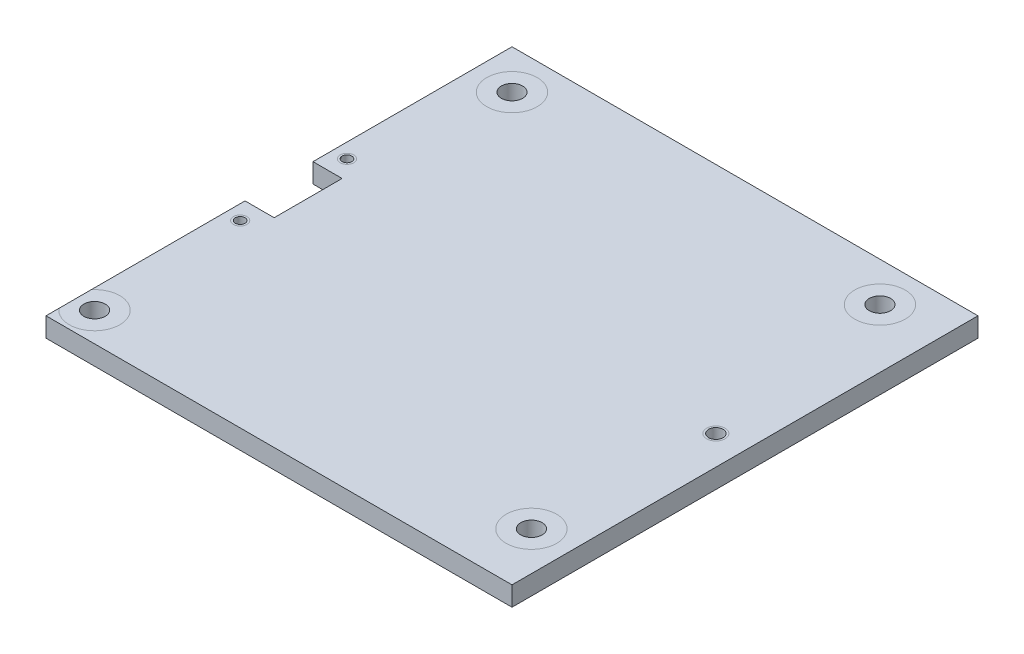
ISO-10303-21;
HEADER;
FILE_DESCRIPTION(('STEP AP214'),'2;1');
FILE_NAME('part.step','',(''),(''),'','','');
FILE_SCHEMA(('AUTOMOTIVE_DESIGN { 1 0 10303 214 1 1 1 1 }'));
ENDSEC;
DATA;
#1=APPLICATION_CONTEXT('core data for automotive mechanical design processes');
#2=APPLICATION_PROTOCOL_DEFINITION('international standard','automotive_design',2000,#1);
#3=PRODUCT_CONTEXT('',#1,'mechanical');
#4=PRODUCT('Part','Part','',(#3));
#5=PRODUCT_RELATED_PRODUCT_CATEGORY('part','',(#4));
#6=PRODUCT_DEFINITION_FORMATION('','',#4);
#7=PRODUCT_DEFINITION_CONTEXT('part definition',#1,'design');
#8=PRODUCT_DEFINITION('design','',#6,#7);
#9=PRODUCT_DEFINITION_SHAPE('','',#8);
#10=(LENGTH_UNIT() NAMED_UNIT(*) SI_UNIT(.MILLI.,.METRE.));
#11=(NAMED_UNIT(*) PLANE_ANGLE_UNIT() SI_UNIT($,.RADIAN.));
#12=(NAMED_UNIT(*) SI_UNIT($,.STERADIAN.) SOLID_ANGLE_UNIT());
#13=UNCERTAINTY_MEASURE_WITH_UNIT(LENGTH_MEASURE(1.E-05),#10,'distance_accuracy_value','');
#14=(GEOMETRIC_REPRESENTATION_CONTEXT(3) GLOBAL_UNCERTAINTY_ASSIGNED_CONTEXT((#13)) GLOBAL_UNIT_ASSIGNED_CONTEXT((#10,
#11,#12)) REPRESENTATION_CONTEXT('',''));
#15=CARTESIAN_POINT('',(0.,0.,0.));
#16=DIRECTION('',(0.,0.,1.));
#17=DIRECTION('',(1.,0.,0.));
#18=AXIS2_PLACEMENT_3D('',#15,#16,#17);
#19=CARTESIAN_POINT('',(15.103448275862,-2.,-34.5));
#20=DIRECTION('',(0.,1.,0.));
#21=DIRECTION('',(0.,0.,1.));
#22=AXIS2_PLACEMENT_3D('',#19,#20,#21);
#23=PLANE('',#22);
#24=CARTESIAN_POINT('',(1.5,-2.,-18.5));
#25=DIRECTION('',(0.,1.,0.));
#26=DIRECTION('',(0.,0.,1.));
#27=AXIS2_PLACEMENT_3D('',#24,#25,#26);
#28=CIRCLE('',#27,0.700000000000001);
#29=CARTESIAN_POINT('',(1.5,-2.,-17.8));
#30=VERTEX_POINT('',#29);
#31=EDGE_CURVE('E213',#30,#30,#28,.F.);
#32=ORIENTED_EDGE('',*,*,#31,.F.);
#33=EDGE_LOOP('',(#32));
#34=FACE_BOUND('',#33,.T.);
#35=CARTESIAN_POINT('',(4.05,-2.,-43.95));
#36=DIRECTION('',(0.,1.,0.));
#37=DIRECTION('',(0.,0.,1.));
#38=AXIS2_PLACEMENT_3D('',#35,#36,#37);
#39=CIRCLE('',#38,2.59999999999999);
#40=CARTESIAN_POINT('',(4.05,-2.,-41.35));
#41=VERTEX_POINT('',#40);
#42=EDGE_CURVE('E197',#41,#41,#39,.F.);
#43=ORIENTED_EDGE('',*,*,#42,.F.);
#44=EDGE_LOOP('',(#43));
#45=FACE_BOUND('',#44,.T.);
#46=CARTESIAN_POINT('',(44.,-2.,-6.));
#47=DIRECTION('',(0.,1.,0.));
#48=DIRECTION('',(0.,0.,1.));
#49=AXIS2_PLACEMENT_3D('',#46,#47,#48);
#50=CIRCLE('',#49,2.6);
#51=CARTESIAN_POINT('',(44.,-2.,-3.4));
#52=VERTEX_POINT('',#51);
#53=EDGE_CURVE('E181',#52,#52,#50,.F.);
#54=ORIENTED_EDGE('',*,*,#53,.F.);
#55=EDGE_LOOP('',(#54));
#56=FACE_BOUND('',#55,.T.);
#57=DIRECTION('',(0.,0.,1.));
#58=VECTOR('',#57,1.);
#59=CARTESIAN_POINT('',(2.99999999999999,-2.,-27.5));
#60=LINE('',#59,#58);
#61=CARTESIAN_POINT('',(2.99999999999999,-2.,-27.5));
#62=VERTEX_POINT('',#61);
#63=CARTESIAN_POINT('',(2.99999999999999,-2.,-20.5));
#64=VERTEX_POINT('',#63);
#65=EDGE_CURVE('E240',#62,#64,#60,.T.);
#66=ORIENTED_EDGE('',*,*,#65,.F.);
#67=DIRECTION('',(1.,0.,0.));
#68=VECTOR('',#67,1.);
#69=CARTESIAN_POINT('',(0.,-2.,-27.5));
#70=LINE('',#69,#68);
#71=CARTESIAN_POINT('',(0.,-2.,-27.5));
#72=VERTEX_POINT('',#71);
#73=EDGE_CURVE('E138',#72,#62,#70,.T.);
#74=ORIENTED_EDGE('',*,*,#73,.F.);
#75=DIRECTION('',(0.,0.,1.));
#76=VECTOR('',#75,1.);
#77=CARTESIAN_POINT('',(0.,-2.,-48.));
#78=LINE('',#77,#76);
#79=CARTESIAN_POINT('',(0.,-2.,-48.));
#80=VERTEX_POINT('',#79);
#81=EDGE_CURVE('E276',#80,#72,#78,.T.);
#82=ORIENTED_EDGE('',*,*,#81,.F.);
#83=DIRECTION('',(-1.,0.,0.));
#84=VECTOR('',#83,1.);
#85=CARTESIAN_POINT('',(0.,-2.,-48.));
#86=LINE('',#85,#84);
#87=CARTESIAN_POINT('',(48.,-2.,-48.));
#88=VERTEX_POINT('',#87);
#89=EDGE_CURVE('E151',#88,#80,#86,.T.);
#90=ORIENTED_EDGE('',*,*,#89,.F.);
#91=DIRECTION('',(0.,0.,-1.));
#92=VECTOR('',#91,1.);
#93=CARTESIAN_POINT('',(48.,-2.,-48.));
#94=LINE('',#93,#92);
#95=CARTESIAN_POINT('',(48.,-2.,0.));
#96=VERTEX_POINT('',#95);
#97=EDGE_CURVE('E153',#96,#88,#94,.T.);
#98=ORIENTED_EDGE('',*,*,#97,.F.);
#99=DIRECTION('',(1.,0.,0.));
#100=VECTOR('',#99,1.);
#101=CARTESIAN_POINT('',(0.,-2.,0.));
#102=LINE('',#101,#100);
#103=CARTESIAN_POINT('',(0.,-2.,0.));
#104=VERTEX_POINT('',#103);
#105=EDGE_CURVE('E160',#104,#96,#102,.T.);
#106=ORIENTED_EDGE('',*,*,#105,.F.);
#107=CARTESIAN_POINT('',(0.,-2.,-1.3386752274164));
#108=VERTEX_POINT('',#107);
#109=EDGE_CURVE('E267',#108,#104,#78,.T.);
#110=ORIENTED_EDGE('',*,*,#109,.F.);
#111=CARTESIAN_POINT('',(2.,-2.,-3.));
#112=DIRECTION('',(0.,1.,0.));
#113=DIRECTION('',(0.,0.,1.));
#114=AXIS2_PLACEMENT_3D('',#111,#112,#113);
#115=CIRCLE('',#114,2.59999999999999);
#116=CARTESIAN_POINT('',(0.,-2.,-4.6613247725836));
#117=VERTEX_POINT('',#116);
#118=EDGE_CURVE('E65',#117,#108,#115,.F.);
#119=ORIENTED_EDGE('',*,*,#118,.F.);
#120=CARTESIAN_POINT('',(0.,-2.,-20.5));
#121=VERTEX_POINT('',#120);
#122=EDGE_CURVE('E272',#121,#117,#78,.T.);
#123=ORIENTED_EDGE('',*,*,#122,.F.);
#124=DIRECTION('',(-1.,0.,0.));
#125=VECTOR('',#124,1.);
#126=CARTESIAN_POINT('',(0.,-2.,-20.5));
#127=LINE('',#126,#125);
#128=EDGE_CURVE('E58',#64,#121,#127,.T.);
#129=ORIENTED_EDGE('',*,*,#128,.F.);
#130=EDGE_LOOP('',(#66,#74,#82,#90,#98,#106,#110,#119,#123,#129));
#131=FACE_BOUND('',#130,.T.);
#132=CARTESIAN_POINT('',(41.95,-2.,-43.95));
#133=DIRECTION('',(0.,1.,0.));
#134=DIRECTION('',(0.,0.,1.));
#135=AXIS2_PLACEMENT_3D('',#132,#133,#134);
#136=CIRCLE('',#135,2.6);
#137=CARTESIAN_POINT('',(41.95,-2.,-41.35));
#138=VERTEX_POINT('',#137);
#139=EDGE_CURVE('E189',#138,#138,#136,.F.);
#140=ORIENTED_EDGE('',*,*,#139,.F.);
#141=EDGE_LOOP('',(#140));
#142=FACE_BOUND('',#141,.T.);
#143=CARTESIAN_POINT('',(45.,-2.,-24.));
#144=DIRECTION('',(0.,1.,0.));
#145=DIRECTION('',(0.,0.,1.));
#146=AXIS2_PLACEMENT_3D('',#143,#144,#145);
#147=CIRCLE('',#146,0.95);
#148=CARTESIAN_POINT('',(45.,-2.,-23.05));
#149=VERTEX_POINT('',#148);
#150=EDGE_CURVE('E205',#149,#149,#147,.F.);
#151=ORIENTED_EDGE('',*,*,#150,.F.);
#152=EDGE_LOOP('',(#151));
#153=FACE_BOUND('',#152,.T.);
#154=CARTESIAN_POINT('',(1.49999999999999,-2.,-29.5));
#155=DIRECTION('',(0.,1.,0.));
#156=DIRECTION('',(0.,0.,1.));
#157=AXIS2_PLACEMENT_3D('',#154,#155,#156);
#158=CIRCLE('',#157,0.700000000000001);
#159=CARTESIAN_POINT('',(1.49999999999999,-2.,-28.8));
#160=VERTEX_POINT('',#159);
#161=EDGE_CURVE('E11',#160,#160,#158,.F.);
#162=ORIENTED_EDGE('',*,*,#161,.F.);
#163=EDGE_LOOP('',(#162));
#164=FACE_BOUND('',#163,.T.);
#165=ADVANCED_FACE('F42',(#34,#45,#56,#131,#142,#153,#164),#23,.F.);
#166=CARTESIAN_POINT('',(15.103448275862,0.,-34.5));
#167=DIRECTION('',(0.,1.,0.));
#168=DIRECTION('',(0.,0.,1.));
#169=AXIS2_PLACEMENT_3D('',#166,#167,#168);
#170=PLANE('',#169);
#171=CARTESIAN_POINT('',(1.5,0.,-18.5));
#172=DIRECTION('',(0.,1.,0.));
#173=DIRECTION('',(0.,0.,1.));
#174=AXIS2_PLACEMENT_3D('',#171,#172,#173);
#175=CIRCLE('',#174,0.700000000000001);
#176=CARTESIAN_POINT('',(1.5,0.,-17.8));
#177=VERTEX_POINT('',#176);
#178=EDGE_CURVE('E209',#177,#177,#175,.F.);
#179=ORIENTED_EDGE('',*,*,#178,.T.);
#180=EDGE_LOOP('',(#179));
#181=FACE_BOUND('',#180,.T.);
#182=CARTESIAN_POINT('',(4.05,0.,-43.95));
#183=DIRECTION('',(0.,1.,0.));
#184=DIRECTION('',(0.,0.,1.));
#185=AXIS2_PLACEMENT_3D('',#182,#183,#184);
#186=CIRCLE('',#185,2.59999999999999);
#187=CARTESIAN_POINT('',(4.05,0.,-41.35));
#188=VERTEX_POINT('',#187);
#189=EDGE_CURVE('E193',#188,#188,#186,.F.);
#190=ORIENTED_EDGE('',*,*,#189,.T.);
#191=EDGE_LOOP('',(#190));
#192=FACE_BOUND('',#191,.T.);
#193=CARTESIAN_POINT('',(44.,0.,-6.));
#194=DIRECTION('',(0.,1.,0.));
#195=DIRECTION('',(0.,0.,1.));
#196=AXIS2_PLACEMENT_3D('',#193,#194,#195);
#197=CIRCLE('',#196,2.6);
#198=CARTESIAN_POINT('',(44.,0.,-3.4));
#199=VERTEX_POINT('',#198);
#200=EDGE_CURVE('E178',#199,#199,#197,.F.);
#201=ORIENTED_EDGE('',*,*,#200,.T.);
#202=EDGE_LOOP('',(#201));
#203=FACE_BOUND('',#202,.T.);
#204=CARTESIAN_POINT('',(41.95,0.,-43.95));
#205=DIRECTION('',(0.,1.,0.));
#206=DIRECTION('',(0.,0.,1.));
#207=AXIS2_PLACEMENT_3D('',#204,#205,#206);
#208=CIRCLE('',#207,2.6);
#209=CARTESIAN_POINT('',(41.95,0.,-41.35));
#210=VERTEX_POINT('',#209);
#211=EDGE_CURVE('E185',#210,#210,#208,.F.);
#212=ORIENTED_EDGE('',*,*,#211,.T.);
#213=EDGE_LOOP('',(#212));
#214=FACE_BOUND('',#213,.T.);
#215=DIRECTION('',(-1.,0.,0.));
#216=VECTOR('',#215,1.);
#217=CARTESIAN_POINT('',(0.,0.,-27.5));
#218=LINE('',#217,#216);
#219=CARTESIAN_POINT('',(2.99999999999999,0.,-27.5));
#220=VERTEX_POINT('',#219);
#221=CARTESIAN_POINT('',(0.,0.,-27.5));
#222=VERTEX_POINT('',#221);
#223=EDGE_CURVE('E128',#220,#222,#218,.T.);
#224=ORIENTED_EDGE('',*,*,#223,.F.);
#225=DIRECTION('',(0.,0.,-1.));
#226=VECTOR('',#225,1.);
#227=CARTESIAN_POINT('',(2.99999999999999,0.,-27.5));
#228=LINE('',#227,#226);
#229=CARTESIAN_POINT('',(2.99999999999999,0.,-20.5));
#230=VERTEX_POINT('',#229);
#231=EDGE_CURVE('E137',#230,#220,#228,.T.);
#232=ORIENTED_EDGE('',*,*,#231,.F.);
#233=DIRECTION('',(1.,0.,0.));
#234=VECTOR('',#233,1.);
#235=CARTESIAN_POINT('',(0.,0.,-20.5));
#236=LINE('',#235,#234);
#237=CARTESIAN_POINT('',(0.,0.,-20.5));
#238=VERTEX_POINT('',#237);
#239=EDGE_CURVE('E122',#238,#230,#236,.T.);
#240=ORIENTED_EDGE('',*,*,#239,.F.);
#241=DIRECTION('',(0.,0.,1.));
#242=VECTOR('',#241,1.);
#243=CARTESIAN_POINT('',(0.,0.,-48.));
#244=LINE('',#243,#242);
#245=CARTESIAN_POINT('',(0.,0.,-4.6613247725836));
#246=VERTEX_POINT('',#245);
#247=EDGE_CURVE('E134',#238,#246,#244,.T.);
#248=ORIENTED_EDGE('',*,*,#247,.T.);
#249=CARTESIAN_POINT('',(2.,0.,-3.));
#250=DIRECTION('',(0.,1.,0.));
#251=DIRECTION('',(0.,0.,1.));
#252=AXIS2_PLACEMENT_3D('',#249,#250,#251);
#253=CIRCLE('',#252,2.59999999999999);
#254=CARTESIAN_POINT('',(0.,0.,-1.3386752274164));
#255=VERTEX_POINT('',#254);
#256=EDGE_CURVE('E175',#246,#255,#253,.F.);
#257=ORIENTED_EDGE('',*,*,#256,.T.);
#258=CARTESIAN_POINT('',(0.,0.,0.));
#259=VERTEX_POINT('',#258);
#260=EDGE_CURVE('E146',#255,#259,#244,.T.);
#261=ORIENTED_EDGE('',*,*,#260,.T.);
#262=DIRECTION('',(1.,0.,0.));
#263=VECTOR('',#262,1.);
#264=CARTESIAN_POINT('',(0.,0.,0.));
#265=LINE('',#264,#263);
#266=CARTESIAN_POINT('',(48.,0.,0.));
#267=VERTEX_POINT('',#266);
#268=EDGE_CURVE('E148',#259,#267,#265,.T.);
#269=ORIENTED_EDGE('',*,*,#268,.T.);
#270=DIRECTION('',(0.,0.,-1.));
#271=VECTOR('',#270,1.);
#272=CARTESIAN_POINT('',(48.,0.,-48.));
#273=LINE('',#272,#271);
#274=CARTESIAN_POINT('',(48.,0.,-48.));
#275=VERTEX_POINT('',#274);
#276=EDGE_CURVE('E291',#267,#275,#273,.T.);
#277=ORIENTED_EDGE('',*,*,#276,.T.);
#278=DIRECTION('',(-1.,0.,0.));
#279=VECTOR('',#278,1.);
#280=CARTESIAN_POINT('',(0.,0.,-48.));
#281=LINE('',#280,#279);
#282=CARTESIAN_POINT('',(0.,0.,-48.));
#283=VERTEX_POINT('',#282);
#284=EDGE_CURVE('E167',#275,#283,#281,.T.);
#285=ORIENTED_EDGE('',*,*,#284,.T.);
#286=EDGE_CURVE('E144',#283,#222,#244,.T.);
#287=ORIENTED_EDGE('',*,*,#286,.T.);
#288=EDGE_LOOP('',(#224,#232,#240,#248,#257,#261,#269,#277,#285,#287));
#289=FACE_BOUND('',#288,.T.);
#290=CARTESIAN_POINT('',(45.,0.,-24.));
#291=DIRECTION('',(0.,1.,0.));
#292=DIRECTION('',(0.,0.,1.));
#293=AXIS2_PLACEMENT_3D('',#290,#291,#292);
#294=CIRCLE('',#293,0.95);
#295=CARTESIAN_POINT('',(45.,0.,-23.05));
#296=VERTEX_POINT('',#295);
#297=EDGE_CURVE('E201',#296,#296,#294,.F.);
#298=ORIENTED_EDGE('',*,*,#297,.T.);
#299=EDGE_LOOP('',(#298));
#300=FACE_BOUND('',#299,.T.);
#301=CARTESIAN_POINT('',(1.49999999999999,0.,-29.5));
#302=DIRECTION('',(0.,1.,0.));
#303=DIRECTION('',(0.,0.,1.));
#304=AXIS2_PLACEMENT_3D('',#301,#302,#303);
#305=CIRCLE('',#304,0.700000000000001);
#306=CARTESIAN_POINT('',(1.49999999999999,0.,-28.8));
#307=VERTEX_POINT('',#306);
#308=EDGE_CURVE('E46',#307,#307,#305,.F.);
#309=ORIENTED_EDGE('',*,*,#308,.T.);
#310=EDGE_LOOP('',(#309));
#311=FACE_BOUND('',#310,.T.);
#312=ADVANCED_FACE('F132',(#181,#192,#203,#214,#289,#300,#311),#170,.T.);
#313=ORIENTED_EDGE('',*,*,#161,.T.);
#314=EDGE_LOOP('',(#313));
#315=FACE_BOUND('',#314,.T.);
#316=CARTESIAN_POINT('',(1.49999999999999,-2.,-29.5));
#317=DIRECTION('',(0.,1.,0.));
#318=DIRECTION('',(0.,0.,1.));
#319=AXIS2_PLACEMENT_3D('',#316,#317,#318);
#320=CIRCLE('',#319,0.500000000000001);
#321=CARTESIAN_POINT('',(1.49999999999999,-2.,-29.));
#322=VERTEX_POINT('',#321);
#323=EDGE_CURVE('E312',#322,#322,#320,.F.);
#324=ORIENTED_EDGE('',*,*,#323,.F.);
#325=EDGE_LOOP('',(#324));
#326=FACE_BOUND('',#325,.T.);
#327=ADVANCED_FACE('F348',(#315,#326),#23,.F.);
#328=ORIENTED_EDGE('',*,*,#308,.F.);
#329=EDGE_LOOP('',(#328));
#330=FACE_BOUND('',#329,.T.);
#331=CARTESIAN_POINT('',(1.49999999999999,0.,-29.5));
#332=DIRECTION('',(0.,1.,0.));
#333=DIRECTION('',(0.,0.,1.));
#334=AXIS2_PLACEMENT_3D('',#331,#332,#333);
#335=CIRCLE('',#334,0.500000000000001);
#336=CARTESIAN_POINT('',(1.49999999999999,0.,-29.));
#337=VERTEX_POINT('',#336);
#338=EDGE_CURVE('E310',#337,#337,#335,.T.);
#339=ORIENTED_EDGE('',*,*,#338,.F.);
#340=EDGE_LOOP('',(#339));
#341=FACE_BOUND('',#340,.T.);
#342=ADVANCED_FACE('F232',(#330,#341),#170,.T.);
#343=ORIENTED_EDGE('',*,*,#31,.T.);
#344=EDGE_LOOP('',(#343));
#345=FACE_BOUND('',#344,.T.);
#346=CARTESIAN_POINT('',(1.5,-2.,-18.5));
#347=DIRECTION('',(0.,1.,0.));
#348=DIRECTION('',(0.,0.,1.));
#349=AXIS2_PLACEMENT_3D('',#346,#347,#348);
#350=CIRCLE('',#349,0.500000000000001);
#351=CARTESIAN_POINT('',(1.5,-2.,-18.));
#352=VERTEX_POINT('',#351);
#353=EDGE_CURVE('E237',#352,#352,#350,.F.);
#354=ORIENTED_EDGE('',*,*,#353,.F.);
#355=EDGE_LOOP('',(#354));
#356=FACE_BOUND('',#355,.T.);
#357=ADVANCED_FACE('F229',(#345,#356),#23,.F.);
#358=ORIENTED_EDGE('',*,*,#178,.F.);
#359=EDGE_LOOP('',(#358));
#360=FACE_BOUND('',#359,.T.);
#361=CARTESIAN_POINT('',(1.5,0.,-18.5));
#362=DIRECTION('',(0.,1.,0.));
#363=DIRECTION('',(0.,0.,1.));
#364=AXIS2_PLACEMENT_3D('',#361,#362,#363);
#365=CIRCLE('',#364,0.500000000000001);
#366=CARTESIAN_POINT('',(1.5,0.,-18.));
#367=VERTEX_POINT('',#366);
#368=EDGE_CURVE('E235',#367,#367,#365,.T.);
#369=ORIENTED_EDGE('',*,*,#368,.F.);
#370=EDGE_LOOP('',(#369));
#371=FACE_BOUND('',#370,.T.);
#372=ADVANCED_FACE('F225',(#360,#371),#170,.T.);
#373=CARTESIAN_POINT('',(0.,0.,-48.));
#374=DIRECTION('',(1.,0.,0.));
#375=DIRECTION('',(0.,0.,-1.));
#376=AXIS2_PLACEMENT_3D('',#373,#374,#375);
#377=PLANE('',#376);
#378=ORIENTED_EDGE('',*,*,#81,.T.);
#379=DIRECTION('',(0.,1.,0.));
#380=VECTOR('',#379,1.);
#381=CARTESIAN_POINT('',(0.,-2.001,-27.5));
#382=LINE('',#381,#380);
#383=EDGE_CURVE('E304',#72,#222,#382,.T.);
#384=ORIENTED_EDGE('',*,*,#383,.T.);
#385=ORIENTED_EDGE('',*,*,#286,.F.);
#386=DIRECTION('',(0.,-1.,0.));
#387=VECTOR('',#386,1.);
#388=CARTESIAN_POINT('',(0.,0.,-48.));
#389=LINE('',#388,#387);
#390=EDGE_CURVE('E164',#283,#80,#389,.T.);
#391=ORIENTED_EDGE('',*,*,#390,.T.);
#392=EDGE_LOOP('',(#378,#384,#385,#391));
#393=FACE_BOUND('',#392,.T.);
#394=ADVANCED_FACE('F228',(#393),#377,.F.);
#395=ORIENTED_EDGE('',*,*,#150,.T.);
#396=EDGE_LOOP('',(#395));
#397=FACE_BOUND('',#396,.T.);
#398=CARTESIAN_POINT('',(45.,-2.,-24.));
#399=DIRECTION('',(0.,1.,0.));
#400=DIRECTION('',(0.,0.,1.));
#401=AXIS2_PLACEMENT_3D('',#398,#399,#400);
#402=CIRCLE('',#401,0.749999999999999);
#403=CARTESIAN_POINT('',(45.,-2.,-23.25));
#404=VERTEX_POINT('',#403);
#405=EDGE_CURVE('E248',#404,#404,#402,.F.);
#406=ORIENTED_EDGE('',*,*,#405,.F.);
#407=EDGE_LOOP('',(#406));
#408=FACE_BOUND('',#407,.T.);
#409=ADVANCED_FACE('F329',(#397,#408),#23,.F.);
#410=ORIENTED_EDGE('',*,*,#297,.F.);
#411=EDGE_LOOP('',(#410));
#412=FACE_BOUND('',#411,.T.);
#413=CARTESIAN_POINT('',(45.,0.,-24.));
#414=DIRECTION('',(0.,1.,0.));
#415=DIRECTION('',(0.,0.,1.));
#416=AXIS2_PLACEMENT_3D('',#413,#414,#415);
#417=CIRCLE('',#416,0.749999999999999);
#418=CARTESIAN_POINT('',(45.,0.,-23.25));
#419=VERTEX_POINT('',#418);
#420=EDGE_CURVE('E317',#419,#419,#417,.T.);
#421=ORIENTED_EDGE('',*,*,#420,.F.);
#422=EDGE_LOOP('',(#421));
#423=FACE_BOUND('',#422,.T.);
#424=ADVANCED_FACE('F231',(#412,#423),#170,.T.);
#425=ORIENTED_EDGE('',*,*,#42,.T.);
#426=EDGE_LOOP('',(#425));
#427=FACE_BOUND('',#426,.T.);
#428=CARTESIAN_POINT('',(4.05,-2.,-43.95));
#429=DIRECTION('',(0.,1.,0.));
#430=DIRECTION('',(0.,0.,1.));
#431=AXIS2_PLACEMENT_3D('',#428,#429,#430);
#432=CIRCLE('',#431,1.1);
#433=CARTESIAN_POINT('',(4.05,-2.,-42.85));
#434=VERTEX_POINT('',#433);
#435=EDGE_CURVE('E247',#434,#434,#432,.T.);
#436=ORIENTED_EDGE('',*,*,#435,.T.);
#437=EDGE_LOOP('',(#436));
#438=FACE_BOUND('',#437,.T.);
#439=ADVANCED_FACE('F328',(#427,#438),#23,.F.);
#440=ORIENTED_EDGE('',*,*,#189,.F.);
#441=EDGE_LOOP('',(#440));
#442=FACE_BOUND('',#441,.T.);
#443=CARTESIAN_POINT('',(4.05,0.,-43.95));
#444=DIRECTION('',(0.,1.,0.));
#445=DIRECTION('',(0.,0.,1.));
#446=AXIS2_PLACEMENT_3D('',#443,#444,#445);
#447=CIRCLE('',#446,1.09999999999999);
#448=CARTESIAN_POINT('',(4.05,0.,-42.85));
#449=VERTEX_POINT('',#448);
#450=EDGE_CURVE('E244',#449,#449,#447,.T.);
#451=ORIENTED_EDGE('',*,*,#450,.F.);
#452=EDGE_LOOP('',(#451));
#453=FACE_BOUND('',#452,.T.);
#454=ADVANCED_FACE('F331',(#442,#453),#170,.T.);
#455=ORIENTED_EDGE('',*,*,#139,.T.);
#456=EDGE_LOOP('',(#455));
#457=FACE_BOUND('',#456,.T.);
#458=CARTESIAN_POINT('',(41.95,-2.,-43.95));
#459=DIRECTION('',(0.,1.,0.));
#460=DIRECTION('',(0.,0.,1.));
#461=AXIS2_PLACEMENT_3D('',#458,#459,#460);
#462=CIRCLE('',#461,1.1);
#463=CARTESIAN_POINT('',(41.95,-2.,-42.85));
#464=VERTEX_POINT('',#463);
#465=EDGE_CURVE('E254',#464,#464,#462,.T.);
#466=ORIENTED_EDGE('',*,*,#465,.T.);
#467=EDGE_LOOP('',(#466));
#468=FACE_BOUND('',#467,.T.);
#469=ADVANCED_FACE('F338',(#457,#468),#23,.F.);
#470=ORIENTED_EDGE('',*,*,#211,.F.);
#471=EDGE_LOOP('',(#470));
#472=FACE_BOUND('',#471,.T.);
#473=CARTESIAN_POINT('',(41.95,0.,-43.95));
#474=DIRECTION('',(0.,1.,0.));
#475=DIRECTION('',(0.,0.,1.));
#476=AXIS2_PLACEMENT_3D('',#473,#474,#475);
#477=CIRCLE('',#476,1.1);
#478=CARTESIAN_POINT('',(41.95,0.,-42.85));
#479=VERTEX_POINT('',#478);
#480=EDGE_CURVE('E251',#479,#479,#477,.T.);
#481=ORIENTED_EDGE('',*,*,#480,.F.);
#482=EDGE_LOOP('',(#481));
#483=FACE_BOUND('',#482,.T.);
#484=ADVANCED_FACE('F345',(#472,#483),#170,.T.);
#485=ORIENTED_EDGE('',*,*,#53,.T.);
#486=EDGE_LOOP('',(#485));
#487=FACE_BOUND('',#486,.T.);
#488=CARTESIAN_POINT('',(44.,-2.,-6.));
#489=DIRECTION('',(0.,1.,0.));
#490=DIRECTION('',(0.,0.,1.));
#491=AXIS2_PLACEMENT_3D('',#488,#489,#490);
#492=CIRCLE('',#491,1.1);
#493=CARTESIAN_POINT('',(44.,-2.,-4.9));
#494=VERTEX_POINT('',#493);
#495=EDGE_CURVE('E260',#494,#494,#492,.T.);
#496=ORIENTED_EDGE('',*,*,#495,.T.);
#497=EDGE_LOOP('',(#496));
#498=FACE_BOUND('',#497,.T.);
#499=ADVANCED_FACE('F360',(#487,#498),#23,.F.);
#500=ORIENTED_EDGE('',*,*,#200,.F.);
#501=EDGE_LOOP('',(#500));
#502=FACE_BOUND('',#501,.T.);
#503=CARTESIAN_POINT('',(44.,0.,-6.));
#504=DIRECTION('',(0.,1.,0.));
#505=DIRECTION('',(0.,0.,1.));
#506=AXIS2_PLACEMENT_3D('',#503,#504,#505);
#507=CIRCLE('',#506,1.1);
#508=CARTESIAN_POINT('',(44.,0.,-4.9));
#509=VERTEX_POINT('',#508);
#510=EDGE_CURVE('E257',#509,#509,#507,.T.);
#511=ORIENTED_EDGE('',*,*,#510,.F.);
#512=EDGE_LOOP('',(#511));
#513=FACE_BOUND('',#512,.T.);
#514=ADVANCED_FACE('F369',(#502,#513),#170,.T.);
#515=ORIENTED_EDGE('',*,*,#247,.F.);
#516=DIRECTION('',(0.,1.,0.));
#517=VECTOR('',#516,1.);
#518=CARTESIAN_POINT('',(0.,-2.001,-20.5));
#519=LINE('',#518,#517);
#520=EDGE_CURVE('E119',#121,#238,#519,.T.);
#521=ORIENTED_EDGE('',*,*,#520,.F.);
#522=ORIENTED_EDGE('',*,*,#122,.T.);
#523=EDGE_CURVE('E270',#117,#108,#78,.T.);
#524=ORIENTED_EDGE('',*,*,#523,.T.);
#525=ORIENTED_EDGE('',*,*,#109,.T.);
#526=DIRECTION('',(0.,-1.,0.));
#527=VECTOR('',#526,1.);
#528=CARTESIAN_POINT('',(0.,0.,0.));
#529=LINE('',#528,#527);
#530=EDGE_CURVE('E172',#259,#104,#529,.T.);
#531=ORIENTED_EDGE('',*,*,#530,.F.);
#532=ORIENTED_EDGE('',*,*,#260,.F.);
#533=EDGE_CURVE('E143',#246,#255,#244,.T.);
#534=ORIENTED_EDGE('',*,*,#533,.F.);
#535=EDGE_LOOP('',(#515,#521,#522,#524,#525,#531,#532,#534));
#536=FACE_BOUND('',#535,.T.);
#537=ADVANCED_FACE('F44',(#536),#377,.F.);
#538=CARTESIAN_POINT('',(0.,0.,0.));
#539=DIRECTION('',(0.,0.,-1.));
#540=DIRECTION('',(-1.,0.,0.));
#541=AXIS2_PLACEMENT_3D('',#538,#539,#540);
#542=PLANE('',#541);
#543=ORIENTED_EDGE('',*,*,#105,.T.);
#544=DIRECTION('',(0.,-1.,0.));
#545=VECTOR('',#544,1.);
#546=CARTESIAN_POINT('',(48.,0.,0.));
#547=LINE('',#546,#545);
#548=EDGE_CURVE('E169',#267,#96,#547,.T.);
#549=ORIENTED_EDGE('',*,*,#548,.F.);
#550=ORIENTED_EDGE('',*,*,#268,.F.);
#551=ORIENTED_EDGE('',*,*,#530,.T.);
#552=EDGE_LOOP('',(#543,#549,#550,#551));
#553=FACE_BOUND('',#552,.T.);
#554=ADVANCED_FACE('F284',(#553),#542,.F.);
#555=CARTESIAN_POINT('',(48.,0.,-48.));
#556=DIRECTION('',(-1.,0.,0.));
#557=DIRECTION('',(0.,0.,1.));
#558=AXIS2_PLACEMENT_3D('',#555,#556,#557);
#559=PLANE('',#558);
#560=ORIENTED_EDGE('',*,*,#97,.T.);
#561=DIRECTION('',(0.,-1.,0.));
#562=VECTOR('',#561,1.);
#563=CARTESIAN_POINT('',(48.,0.,-48.));
#564=LINE('',#563,#562);
#565=EDGE_CURVE('E166',#275,#88,#564,.T.);
#566=ORIENTED_EDGE('',*,*,#565,.F.);
#567=ORIENTED_EDGE('',*,*,#276,.F.);
#568=ORIENTED_EDGE('',*,*,#548,.T.);
#569=EDGE_LOOP('',(#560,#566,#567,#568));
#570=FACE_BOUND('',#569,.T.);
#571=ADVANCED_FACE('F289',(#570),#559,.F.);
#572=CARTESIAN_POINT('',(0.,0.,-48.));
#573=DIRECTION('',(0.,0.,1.));
#574=DIRECTION('',(1.,0.,0.));
#575=AXIS2_PLACEMENT_3D('',#572,#573,#574);
#576=PLANE('',#575);
#577=ORIENTED_EDGE('',*,*,#89,.T.);
#578=ORIENTED_EDGE('',*,*,#390,.F.);
#579=ORIENTED_EDGE('',*,*,#284,.F.);
#580=ORIENTED_EDGE('',*,*,#565,.T.);
#581=EDGE_LOOP('',(#577,#578,#579,#580));
#582=FACE_BOUND('',#581,.T.);
#583=ADVANCED_FACE('F367',(#582),#576,.F.);
#584=ORIENTED_EDGE('',*,*,#256,.F.);
#585=ORIENTED_EDGE('',*,*,#533,.T.);
#586=EDGE_LOOP('',(#584,#585));
#587=FACE_BOUND('',#586,.T.);
#588=CARTESIAN_POINT('',(2.,0.,-3.));
#589=DIRECTION('',(0.,1.,0.));
#590=DIRECTION('',(0.,0.,1.));
#591=AXIS2_PLACEMENT_3D('',#588,#589,#590);
#592=CIRCLE('',#591,1.09999999999999);
#593=CARTESIAN_POINT('',(2.,0.,-1.90000000000001));
#594=VERTEX_POINT('',#593);
#595=EDGE_CURVE('E263',#594,#594,#592,.T.);
#596=ORIENTED_EDGE('',*,*,#595,.F.);
#597=EDGE_LOOP('',(#596));
#598=FACE_BOUND('',#597,.T.);
#599=ADVANCED_FACE('F341',(#587,#598),#170,.T.);
#600=CARTESIAN_POINT('',(2.,-2.,-3.));
#601=DIRECTION('',(0.,1.,0.));
#602=DIRECTION('',(0.,0.,1.));
#603=AXIS2_PLACEMENT_3D('',#600,#601,#602);
#604=CIRCLE('',#603,1.1);
#605=CARTESIAN_POINT('',(2.,-2.,-1.9));
#606=VERTEX_POINT('',#605);
#607=EDGE_CURVE('E265',#606,#606,#604,.T.);
#608=ORIENTED_EDGE('',*,*,#607,.T.);
#609=EDGE_LOOP('',(#608));
#610=FACE_BOUND('',#609,.T.);
#611=ORIENTED_EDGE('',*,*,#523,.F.);
#612=ORIENTED_EDGE('',*,*,#118,.T.);
#613=EDGE_LOOP('',(#611,#612));
#614=FACE_BOUND('',#613,.T.);
#615=ADVANCED_FACE('F349',(#610,#614),#23,.F.);
#616=CARTESIAN_POINT('',(2.,0.,-3.));
#617=DIRECTION('',(0.,1.,0.));
#618=DIRECTION('',(0.,0.,1.));
#619=AXIS2_PLACEMENT_3D('',#616,#617,#618);
#620=CYLINDRICAL_SURFACE('',#619,1.1);
#621=ORIENTED_EDGE('',*,*,#607,.F.);
#622=EDGE_LOOP('',(#621));
#623=FACE_BOUND('',#622,.T.);
#624=ORIENTED_EDGE('',*,*,#595,.T.);
#625=EDGE_LOOP('',(#624));
#626=FACE_BOUND('',#625,.T.);
#627=ADVANCED_FACE('F359',(#623,#626),#620,.F.);
#628=CARTESIAN_POINT('',(44.,0.,-6.));
#629=DIRECTION('',(0.,1.,0.));
#630=DIRECTION('',(0.,0.,1.));
#631=AXIS2_PLACEMENT_3D('',#628,#629,#630);
#632=CYLINDRICAL_SURFACE('',#631,1.1);
#633=ORIENTED_EDGE('',*,*,#495,.F.);
#634=EDGE_LOOP('',(#633));
#635=FACE_BOUND('',#634,.T.);
#636=ORIENTED_EDGE('',*,*,#510,.T.);
#637=EDGE_LOOP('',(#636));
#638=FACE_BOUND('',#637,.T.);
#639=ADVANCED_FACE('F365',(#635,#638),#632,.F.);
#640=CARTESIAN_POINT('',(41.95,0.,-43.95));
#641=DIRECTION('',(0.,1.,0.));
#642=DIRECTION('',(0.,0.,1.));
#643=AXIS2_PLACEMENT_3D('',#640,#641,#642);
#644=CYLINDRICAL_SURFACE('',#643,1.1);
#645=ORIENTED_EDGE('',*,*,#465,.F.);
#646=EDGE_LOOP('',(#645));
#647=FACE_BOUND('',#646,.T.);
#648=ORIENTED_EDGE('',*,*,#480,.T.);
#649=EDGE_LOOP('',(#648));
#650=FACE_BOUND('',#649,.T.);
#651=ADVANCED_FACE('F387',(#647,#650),#644,.F.);
#652=CARTESIAN_POINT('',(4.05,0.,-43.95));
#653=DIRECTION('',(0.,1.,0.));
#654=DIRECTION('',(0.,0.,1.));
#655=AXIS2_PLACEMENT_3D('',#652,#653,#654);
#656=CYLINDRICAL_SURFACE('',#655,1.1);
#657=ORIENTED_EDGE('',*,*,#435,.F.);
#658=EDGE_LOOP('',(#657));
#659=FACE_BOUND('',#658,.T.);
#660=ORIENTED_EDGE('',*,*,#450,.T.);
#661=EDGE_LOOP('',(#660));
#662=FACE_BOUND('',#661,.T.);
#663=ADVANCED_FACE('F390',(#659,#662),#656,.F.);
#664=CARTESIAN_POINT('',(0.,-2.001,-27.5));
#665=DIRECTION('',(0.,0.,-1.));
#666=DIRECTION('',(-1.,0.,0.));
#667=AXIS2_PLACEMENT_3D('',#664,#665,#666);
#668=PLANE('',#667);
#669=ORIENTED_EDGE('',*,*,#73,.T.);
#670=DIRECTION('',(0.,1.,0.));
#671=VECTOR('',#670,1.);
#672=CARTESIAN_POINT('',(2.99999999999999,-2.001,-27.5));
#673=LINE('',#672,#671);
#674=EDGE_CURVE('E306',#62,#220,#673,.T.);
#675=ORIENTED_EDGE('',*,*,#674,.T.);
#676=ORIENTED_EDGE('',*,*,#223,.T.);
#677=ORIENTED_EDGE('',*,*,#383,.F.);
#678=EDGE_LOOP('',(#669,#675,#676,#677));
#679=FACE_BOUND('',#678,.T.);
#680=ADVANCED_FACE('F398',(#679),#668,.F.);
#681=CARTESIAN_POINT('',(2.99999999999999,-2.001,-27.5));
#682=DIRECTION('',(1.,0.,0.));
#683=DIRECTION('',(0.,0.,-1.));
#684=AXIS2_PLACEMENT_3D('',#681,#682,#683);
#685=PLANE('',#684);
#686=ORIENTED_EDGE('',*,*,#65,.T.);
#687=DIRECTION('',(0.,1.,0.));
#688=VECTOR('',#687,1.);
#689=CARTESIAN_POINT('',(2.99999999999999,-2.001,-20.5));
#690=LINE('',#689,#688);
#691=EDGE_CURVE('E127',#64,#230,#690,.T.);
#692=ORIENTED_EDGE('',*,*,#691,.T.);
#693=ORIENTED_EDGE('',*,*,#231,.T.);
#694=ORIENTED_EDGE('',*,*,#674,.F.);
#695=EDGE_LOOP('',(#686,#692,#693,#694));
#696=FACE_BOUND('',#695,.T.);
#697=ADVANCED_FACE('F309',(#696),#685,.F.);
#698=CARTESIAN_POINT('',(0.,-2.001,-20.5));
#699=DIRECTION('',(0.,0.,1.));
#700=DIRECTION('',(1.,0.,0.));
#701=AXIS2_PLACEMENT_3D('',#698,#699,#700);
#702=PLANE('',#701);
#703=ORIENTED_EDGE('',*,*,#128,.T.);
#704=ORIENTED_EDGE('',*,*,#520,.T.);
#705=ORIENTED_EDGE('',*,*,#239,.T.);
#706=ORIENTED_EDGE('',*,*,#691,.F.);
#707=EDGE_LOOP('',(#703,#704,#705,#706));
#708=FACE_BOUND('',#707,.T.);
#709=ADVANCED_FACE('F121',(#708),#702,.F.);
#710=CARTESIAN_POINT('',(1.5,-2.001,-18.5));
#711=DIRECTION('',(0.,1.,0.));
#712=DIRECTION('',(0.,0.,1.));
#713=AXIS2_PLACEMENT_3D('',#710,#711,#712);
#714=CYLINDRICAL_SURFACE('',#713,0.500000000000001);
#715=ORIENTED_EDGE('',*,*,#368,.T.);
#716=EDGE_LOOP('',(#715));
#717=FACE_BOUND('',#716,.T.);
#718=ORIENTED_EDGE('',*,*,#353,.T.);
#719=EDGE_LOOP('',(#718));
#720=FACE_BOUND('',#719,.T.);
#721=ADVANCED_FACE('F404',(#717,#720),#714,.F.);
#722=CARTESIAN_POINT('',(1.49999999999999,-2.001,-29.5));
#723=DIRECTION('',(0.,1.,0.));
#724=DIRECTION('',(0.,0.,1.));
#725=AXIS2_PLACEMENT_3D('',#722,#723,#724);
#726=CYLINDRICAL_SURFACE('',#725,0.500000000000001);
#727=ORIENTED_EDGE('',*,*,#338,.T.);
#728=EDGE_LOOP('',(#727));
#729=FACE_BOUND('',#728,.T.);
#730=ORIENTED_EDGE('',*,*,#323,.T.);
#731=EDGE_LOOP('',(#730));
#732=FACE_BOUND('',#731,.T.);
#733=ADVANCED_FACE('F407',(#729,#732),#726,.F.);
#734=CARTESIAN_POINT('',(45.,-2.001,-24.));
#735=DIRECTION('',(0.,1.,0.));
#736=DIRECTION('',(0.,0.,1.));
#737=AXIS2_PLACEMENT_3D('',#734,#735,#736);
#738=CYLINDRICAL_SURFACE('',#737,0.749999999999999);
#739=ORIENTED_EDGE('',*,*,#420,.T.);
#740=EDGE_LOOP('',(#739));
#741=FACE_BOUND('',#740,.T.);
#742=ORIENTED_EDGE('',*,*,#405,.T.);
#743=EDGE_LOOP('',(#742));
#744=FACE_BOUND('',#743,.T.);
#745=ADVANCED_FACE('F324',(#741,#744),#738,.F.);
#746=CLOSED_SHELL('',(#165,#312,#327,#342,#357,#372,#394,#409,#424,#439,#454,#469,#484,#499,
#514,#537,#554,#571,#583,#599,#615,#627,#639,#651,#663,#680,#697,#709,#721,#733,#745));
#747=MANIFOLD_SOLID_BREP('B2',#746);
#748=ADVANCED_BREP_SHAPE_REPRESENTATION('',(#18,#747),#14);
#749=SHAPE_DEFINITION_REPRESENTATION(#9,#748);
ENDSEC;
END-ISO-10303-21;
